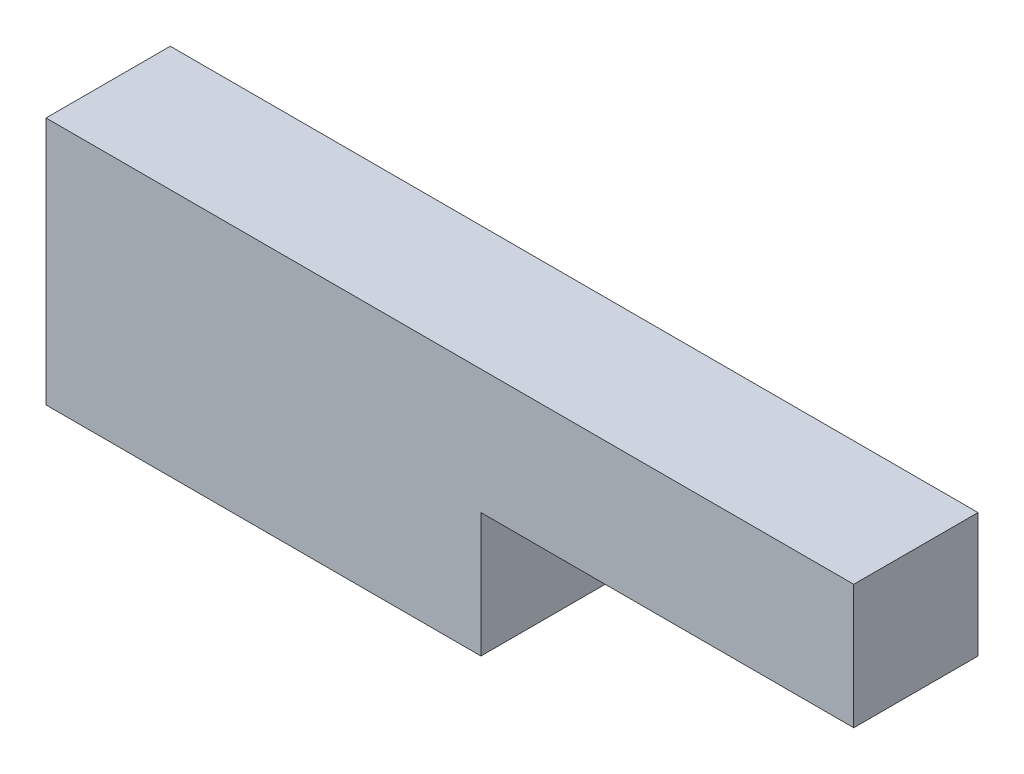
ISO-10303-21;
HEADER;
FILE_DESCRIPTION(('STEP AP214'),'2;1');
FILE_NAME('part.step','',(''),(''),'','','');
FILE_SCHEMA(('AUTOMOTIVE_DESIGN { 1 0 10303 214 1 1 1 1 }'));
ENDSEC;
DATA;
#1=APPLICATION_CONTEXT('core data for automotive mechanical design processes');
#2=APPLICATION_PROTOCOL_DEFINITION('international standard','automotive_design',2000,#1);
#3=PRODUCT_CONTEXT('',#1,'mechanical');
#4=PRODUCT('Part','Part','',(#3));
#5=PRODUCT_RELATED_PRODUCT_CATEGORY('part','',(#4));
#6=PRODUCT_DEFINITION_FORMATION('','',#4);
#7=PRODUCT_DEFINITION_CONTEXT('part definition',#1,'design');
#8=PRODUCT_DEFINITION('design','',#6,#7);
#9=PRODUCT_DEFINITION_SHAPE('','',#8);
#10=(LENGTH_UNIT() NAMED_UNIT(*) SI_UNIT(.MILLI.,.METRE.));
#11=(NAMED_UNIT(*) PLANE_ANGLE_UNIT() SI_UNIT($,.RADIAN.));
#12=(NAMED_UNIT(*) SI_UNIT($,.STERADIAN.) SOLID_ANGLE_UNIT());
#13=UNCERTAINTY_MEASURE_WITH_UNIT(LENGTH_MEASURE(1.E-05),#10,'distance_accuracy_value','');
#14=(GEOMETRIC_REPRESENTATION_CONTEXT(3) GLOBAL_UNCERTAINTY_ASSIGNED_CONTEXT((#13)) GLOBAL_UNIT_ASSIGNED_CONTEXT((#10,
#11,#12)) REPRESENTATION_CONTEXT('',''));
#15=CARTESIAN_POINT('',(0.,0.,0.));
#16=DIRECTION('',(0.,0.,1.));
#17=DIRECTION('',(1.,0.,0.));
#18=AXIS2_PLACEMENT_3D('',#15,#16,#17);
#19=CARTESIAN_POINT('',(177.8,0.,50.8000000000002));
#20=DIRECTION('',(0.,1.,0.));
#21=DIRECTION('',(0.,0.,1.));
#22=AXIS2_PLACEMENT_3D('',#19,#20,#21);
#23=PLANE('',#22);
#24=DIRECTION('',(1.,0.,0.));
#25=VECTOR('',#24,1.);
#26=CARTESIAN_POINT('',(177.8,0.,0.));
#27=LINE('',#26,#25);
#28=CARTESIAN_POINT('',(0.,0.,0.));
#29=VERTEX_POINT('',#28);
#30=CARTESIAN_POINT('',(177.8,0.,0.));
#31=VERTEX_POINT('',#30);
#32=EDGE_CURVE('E141',#29,#31,#27,.T.);
#33=ORIENTED_EDGE('',*,*,#32,.T.);
#34=DIRECTION('',(0.,0.,-1.));
#35=VECTOR('',#34,1.);
#36=CARTESIAN_POINT('',(177.8,0.,50.8000000000002));
#37=LINE('',#36,#35);
#38=CARTESIAN_POINT('',(177.8,0.,50.8000000000002));
#39=VERTEX_POINT('',#38);
#40=EDGE_CURVE('E11',#39,#31,#37,.T.);
#41=ORIENTED_EDGE('',*,*,#40,.F.);
#42=DIRECTION('',(1.,0.,0.));
#43=VECTOR('',#42,1.);
#44=CARTESIAN_POINT('',(177.8,0.,50.8000000000002));
#45=LINE('',#44,#43);
#46=CARTESIAN_POINT('',(0.,0.,50.8000000000002));
#47=VERTEX_POINT('',#46);
#48=EDGE_CURVE('E157',#47,#39,#45,.T.);
#49=ORIENTED_EDGE('',*,*,#48,.F.);
#50=DIRECTION('',(0.,0.,-1.));
#51=VECTOR('',#50,1.);
#52=CARTESIAN_POINT('',(0.,0.,50.8000000000002));
#53=LINE('',#52,#51);
#54=EDGE_CURVE('E137',#47,#29,#53,.T.);
#55=ORIENTED_EDGE('',*,*,#54,.T.);
#56=EDGE_LOOP('',(#33,#41,#49,#55));
#57=FACE_BOUND('',#56,.T.);
#58=ADVANCED_FACE('F49',(#57),#23,.F.);
#59=CARTESIAN_POINT('',(177.8,50.8,50.8000000000002));
#60=DIRECTION('',(-1.,0.,0.));
#61=DIRECTION('',(0.,0.,1.));
#62=AXIS2_PLACEMENT_3D('',#59,#60,#61);
#63=PLANE('',#62);
#64=DIRECTION('',(0.,1.,0.));
#65=VECTOR('',#64,1.);
#66=CARTESIAN_POINT('',(177.8,50.8,0.));
#67=LINE('',#66,#65);
#68=CARTESIAN_POINT('',(177.8,50.8,0.));
#69=VERTEX_POINT('',#68);
#70=EDGE_CURVE('E145',#31,#69,#67,.T.);
#71=ORIENTED_EDGE('',*,*,#70,.T.);
#72=DIRECTION('',(0.,0.,-1.));
#73=VECTOR('',#72,1.);
#74=CARTESIAN_POINT('',(177.8,50.8,50.8000000000002));
#75=LINE('',#74,#73);
#76=CARTESIAN_POINT('',(177.8,50.8,50.8000000000002));
#77=VERTEX_POINT('',#76);
#78=EDGE_CURVE('E58',#77,#69,#75,.T.);
#79=ORIENTED_EDGE('',*,*,#78,.F.);
#80=DIRECTION('',(0.,1.,0.));
#81=VECTOR('',#80,1.);
#82=CARTESIAN_POINT('',(177.8,50.8,50.8000000000002));
#83=LINE('',#82,#81);
#84=EDGE_CURVE('E103',#39,#77,#83,.T.);
#85=ORIENTED_EDGE('',*,*,#84,.F.);
#86=ORIENTED_EDGE('',*,*,#40,.T.);
#87=EDGE_LOOP('',(#71,#79,#85,#86));
#88=FACE_BOUND('',#87,.T.);
#89=ADVANCED_FACE('F183',(#88),#63,.F.);
#90=CARTESIAN_POINT('',(330.2,50.8,50.8000000000002));
#91=DIRECTION('',(0.,1.,0.));
#92=DIRECTION('',(-1.,0.,0.));
#93=AXIS2_PLACEMENT_3D('',#90,#91,#92);
#94=PLANE('',#93);
#95=DIRECTION('',(1.,0.,0.));
#96=VECTOR('',#95,1.);
#97=CARTESIAN_POINT('',(330.2,50.8,0.));
#98=LINE('',#97,#96);
#99=CARTESIAN_POINT('',(330.2,50.8,0.));
#100=VERTEX_POINT('',#99);
#101=EDGE_CURVE('E148',#69,#100,#98,.T.);
#102=ORIENTED_EDGE('',*,*,#101,.T.);
#103=DIRECTION('',(0.,0.,-1.));
#104=VECTOR('',#103,1.);
#105=CARTESIAN_POINT('',(330.2,50.8,50.8000000000002));
#106=LINE('',#105,#104);
#107=CARTESIAN_POINT('',(330.2,50.8,50.8000000000002));
#108=VERTEX_POINT('',#107);
#109=EDGE_CURVE('E127',#108,#100,#106,.T.);
#110=ORIENTED_EDGE('',*,*,#109,.F.);
#111=DIRECTION('',(1.,0.,0.));
#112=VECTOR('',#111,1.);
#113=CARTESIAN_POINT('',(330.2,50.8,50.8000000000002));
#114=LINE('',#113,#112);
#115=EDGE_CURVE('E116',#77,#108,#114,.T.);
#116=ORIENTED_EDGE('',*,*,#115,.F.);
#117=ORIENTED_EDGE('',*,*,#78,.T.);
#118=EDGE_LOOP('',(#102,#110,#116,#117));
#119=FACE_BOUND('',#118,.T.);
#120=ADVANCED_FACE('F166',(#119),#94,.F.);
#121=CARTESIAN_POINT('',(330.2,101.6,50.8000000000002));
#122=DIRECTION('',(-1.,0.,0.));
#123=DIRECTION('',(0.,0.,1.));
#124=AXIS2_PLACEMENT_3D('',#121,#122,#123);
#125=PLANE('',#124);
#126=DIRECTION('',(0.,1.,0.));
#127=VECTOR('',#126,1.);
#128=CARTESIAN_POINT('',(330.2,101.6,0.));
#129=LINE('',#128,#127);
#130=CARTESIAN_POINT('',(330.2,101.6,0.));
#131=VERTEX_POINT('',#130);
#132=EDGE_CURVE('E125',#100,#131,#129,.T.);
#133=ORIENTED_EDGE('',*,*,#132,.T.);
#134=DIRECTION('',(0.,0.,-1.));
#135=VECTOR('',#134,1.);
#136=CARTESIAN_POINT('',(330.2,101.6,50.8000000000002));
#137=LINE('',#136,#135);
#138=CARTESIAN_POINT('',(330.2,101.6,50.8000000000002));
#139=VERTEX_POINT('',#138);
#140=EDGE_CURVE('E122',#139,#131,#137,.T.);
#141=ORIENTED_EDGE('',*,*,#140,.F.);
#142=DIRECTION('',(0.,1.,0.));
#143=VECTOR('',#142,1.);
#144=CARTESIAN_POINT('',(330.2,101.6,50.8000000000002));
#145=LINE('',#144,#143);
#146=EDGE_CURVE('E110',#108,#139,#145,.T.);
#147=ORIENTED_EDGE('',*,*,#146,.F.);
#148=ORIENTED_EDGE('',*,*,#109,.T.);
#149=EDGE_LOOP('',(#133,#141,#147,#148));
#150=FACE_BOUND('',#149,.T.);
#151=ADVANCED_FACE('F123',(#150),#125,.F.);
#152=CARTESIAN_POINT('',(0.,101.6,50.8000000000002));
#153=DIRECTION('',(0.,-1.,0.));
#154=DIRECTION('',(0.,0.,-1.));
#155=AXIS2_PLACEMENT_3D('',#152,#153,#154);
#156=PLANE('',#155);
#157=DIRECTION('',(-1.,0.,0.));
#158=VECTOR('',#157,1.);
#159=CARTESIAN_POINT('',(0.,101.6,0.));
#160=LINE('',#159,#158);
#161=CARTESIAN_POINT('',(0.,101.6,0.));
#162=VERTEX_POINT('',#161);
#163=EDGE_CURVE('E89',#131,#162,#160,.T.);
#164=ORIENTED_EDGE('',*,*,#163,.T.);
#165=DIRECTION('',(0.,0.,-1.));
#166=VECTOR('',#165,1.);
#167=CARTESIAN_POINT('',(0.,101.6,50.8000000000002));
#168=LINE('',#167,#166);
#169=CARTESIAN_POINT('',(0.,101.6,50.8000000000002));
#170=VERTEX_POINT('',#169);
#171=EDGE_CURVE('E128',#170,#162,#168,.T.);
#172=ORIENTED_EDGE('',*,*,#171,.F.);
#173=DIRECTION('',(-1.,0.,0.));
#174=VECTOR('',#173,1.);
#175=CARTESIAN_POINT('',(0.,101.6,50.8000000000002));
#176=LINE('',#175,#174);
#177=EDGE_CURVE('E114',#139,#170,#176,.T.);
#178=ORIENTED_EDGE('',*,*,#177,.F.);
#179=ORIENTED_EDGE('',*,*,#140,.T.);
#180=EDGE_LOOP('',(#164,#172,#178,#179));
#181=FACE_BOUND('',#180,.T.);
#182=ADVANCED_FACE('F130',(#181),#156,.F.);
#183=CARTESIAN_POINT('',(0.,0.,50.8000000000002));
#184=DIRECTION('',(1.,0.,0.));
#185=DIRECTION('',(0.,0.,-1.));
#186=AXIS2_PLACEMENT_3D('',#183,#184,#185);
#187=PLANE('',#186);
#188=DIRECTION('',(0.,-1.,0.));
#189=VECTOR('',#188,1.);
#190=CARTESIAN_POINT('',(0.,0.,0.));
#191=LINE('',#190,#189);
#192=EDGE_CURVE('E95',#162,#29,#191,.T.);
#193=ORIENTED_EDGE('',*,*,#192,.T.);
#194=ORIENTED_EDGE('',*,*,#54,.F.);
#195=DIRECTION('',(0.,-1.,0.));
#196=VECTOR('',#195,1.);
#197=CARTESIAN_POINT('',(0.,0.,50.8000000000002));
#198=LINE('',#197,#196);
#199=EDGE_CURVE('E66',#170,#47,#198,.T.);
#200=ORIENTED_EDGE('',*,*,#199,.F.);
#201=ORIENTED_EDGE('',*,*,#171,.T.);
#202=EDGE_LOOP('',(#193,#194,#200,#201));
#203=FACE_BOUND('',#202,.T.);
#204=ADVANCED_FACE('F173',(#203),#187,.F.);
#205=CARTESIAN_POINT('',(0.,0.,50.8000000000002));
#206=DIRECTION('',(0.,0.,-1.));
#207=DIRECTION('',(-1.,0.,0.));
#208=AXIS2_PLACEMENT_3D('',#205,#206,#207);
#209=PLANE('',#208);
#210=ORIENTED_EDGE('',*,*,#48,.T.);
#211=ORIENTED_EDGE('',*,*,#84,.T.);
#212=ORIENTED_EDGE('',*,*,#115,.T.);
#213=ORIENTED_EDGE('',*,*,#146,.T.);
#214=ORIENTED_EDGE('',*,*,#177,.T.);
#215=ORIENTED_EDGE('',*,*,#199,.T.);
#216=EDGE_LOOP('',(#210,#211,#212,#213,#214,#215));
#217=FACE_BOUND('',#216,.T.);
#218=ADVANCED_FACE('F112',(#217),#209,.F.);
#219=CARTESIAN_POINT('',(0.,0.,0.));
#220=DIRECTION('',(0.,0.,-1.));
#221=DIRECTION('',(-1.,0.,0.));
#222=AXIS2_PLACEMENT_3D('',#219,#220,#221);
#223=PLANE('',#222);
#224=ORIENTED_EDGE('',*,*,#32,.F.);
#225=ORIENTED_EDGE('',*,*,#192,.F.);
#226=ORIENTED_EDGE('',*,*,#163,.F.);
#227=ORIENTED_EDGE('',*,*,#132,.F.);
#228=ORIENTED_EDGE('',*,*,#101,.F.);
#229=ORIENTED_EDGE('',*,*,#70,.F.);
#230=EDGE_LOOP('',(#224,#225,#226,#227,#228,#229));
#231=FACE_BOUND('',#230,.T.);
#232=ADVANCED_FACE('F169',(#231),#223,.T.);
#233=CLOSED_SHELL('',(#58,#89,#120,#151,#182,#204,#218,#232));
#234=MANIFOLD_SOLID_BREP('B2',#233);
#235=ADVANCED_BREP_SHAPE_REPRESENTATION('',(#18,#234),#14);
#236=SHAPE_DEFINITION_REPRESENTATION(#9,#235);
ENDSEC;
END-ISO-10303-21;
